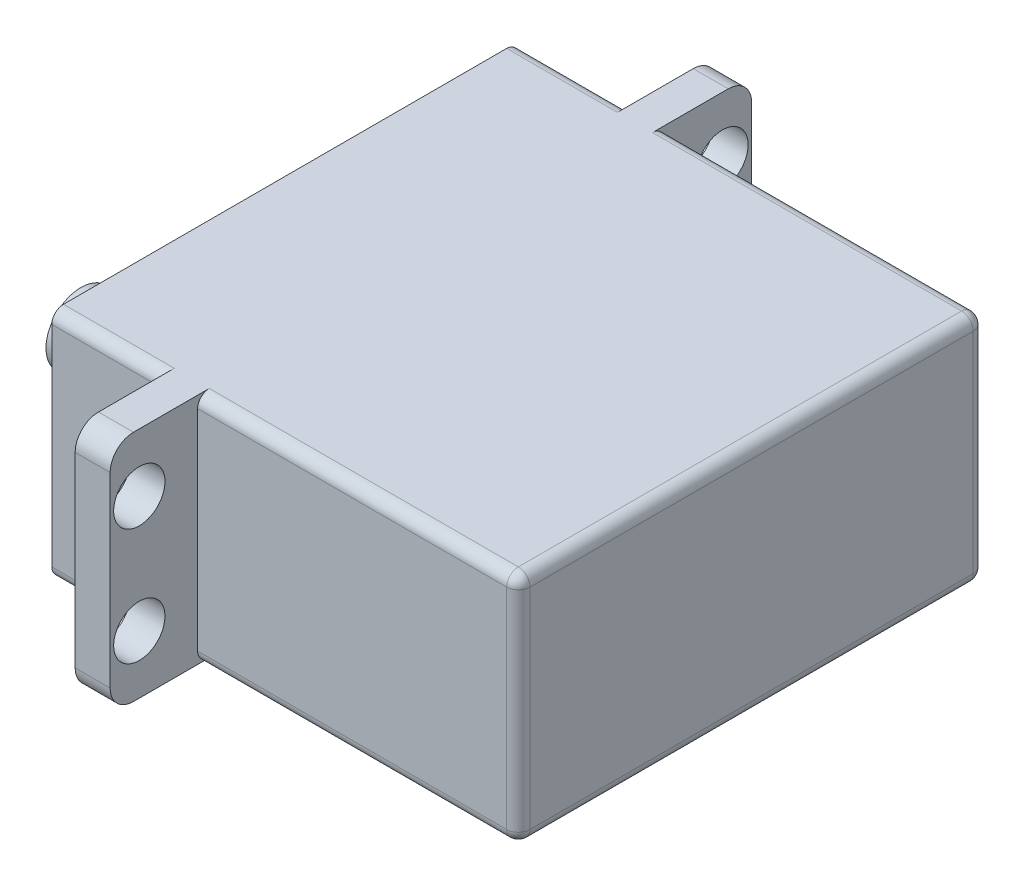
ISO-10303-21;
HEADER;
FILE_DESCRIPTION(('STEP AP214'),'2;1');
FILE_NAME('part.step','',(''),(''),'','','');
FILE_SCHEMA(('AUTOMOTIVE_DESIGN { 1 0 10303 214 1 1 1 1 }'));
ENDSEC;
DATA;
#1=APPLICATION_CONTEXT('core data for automotive mechanical design processes');
#2=APPLICATION_PROTOCOL_DEFINITION('international standard','automotive_design',2000,#1);
#3=PRODUCT_CONTEXT('',#1,'mechanical');
#4=PRODUCT('Part','Part','',(#3));
#5=PRODUCT_RELATED_PRODUCT_CATEGORY('part','',(#4));
#6=PRODUCT_DEFINITION_FORMATION('','',#4);
#7=PRODUCT_DEFINITION_CONTEXT('part definition',#1,'design');
#8=PRODUCT_DEFINITION('design','',#6,#7);
#9=PRODUCT_DEFINITION_SHAPE('','',#8);
#10=(LENGTH_UNIT() NAMED_UNIT(*) SI_UNIT(.MILLI.,.METRE.));
#11=(NAMED_UNIT(*) PLANE_ANGLE_UNIT() SI_UNIT($,.RADIAN.));
#12=(NAMED_UNIT(*) SI_UNIT($,.STERADIAN.) SOLID_ANGLE_UNIT());
#13=UNCERTAINTY_MEASURE_WITH_UNIT(LENGTH_MEASURE(1.E-05),#10,'distance_accuracy_value','');
#14=(GEOMETRIC_REPRESENTATION_CONTEXT(3) GLOBAL_UNCERTAINTY_ASSIGNED_CONTEXT((#13)) GLOBAL_UNIT_ASSIGNED_CONTEXT((#10,
#11,#12)) REPRESENTATION_CONTEXT('',''));
#15=CARTESIAN_POINT('',(0.,0.,0.));
#16=DIRECTION('',(0.,0.,1.));
#17=DIRECTION('',(1.,0.,0.));
#18=AXIS2_PLACEMENT_3D('',#15,#16,#17);
#19=CARTESIAN_POINT('',(-3.,-18.,5.5));
#20=DIRECTION('',(-1.,0.,0.));
#21=DIRECTION('',(0.,0.,1.));
#22=AXIS2_PLACEMENT_3D('',#19,#20,#21);
#23=PLANE('',#22);
#24=DIRECTION('',(0.,1.,0.));
#25=VECTOR('',#24,1.);
#26=CARTESIAN_POINT('',(-3.,-18.,0.));
#27=LINE('',#26,#25);
#28=CARTESIAN_POINT('',(-3.,-19.,0.));
#29=VERTEX_POINT('',#28);
#30=CARTESIAN_POINT('',(-3.,-1.,0.));
#31=VERTEX_POINT('',#30);
#32=EDGE_CURVE('E381',#29,#31,#27,.T.);
#33=ORIENTED_EDGE('',*,*,#32,.F.);
#34=CARTESIAN_POINT('',(-3.,-19.,-1.));
#35=DIRECTION('',(-1.,0.,0.));
#36=DIRECTION('',(0.,0.,1.));
#37=AXIS2_PLACEMENT_3D('',#34,#35,#36);
#38=CIRCLE('',#37,1.);
#39=CARTESIAN_POINT('',(-3.,-20.,-1.));
#40=VERTEX_POINT('',#39);
#41=EDGE_CURVE('E326',#29,#40,#38,.F.);
#42=ORIENTED_EDGE('',*,*,#41,.T.);
#43=DIRECTION('',(0.,0.,1.));
#44=VECTOR('',#43,1.);
#45=CARTESIAN_POINT('',(-3.,-20.,5.49999999999999));
#46=LINE('',#45,#44);
#47=CARTESIAN_POINT('',(-3.,-20.,5.49999999999999));
#48=VERTEX_POINT('',#47);
#49=EDGE_CURVE('E227',#40,#48,#46,.T.);
#50=ORIENTED_EDGE('',*,*,#49,.T.);
#51=CARTESIAN_POINT('',(-3.,-18.,5.5));
#52=DIRECTION('',(-1.,0.,0.));
#53=DIRECTION('',(0.,0.,1.));
#54=AXIS2_PLACEMENT_3D('',#51,#52,#53);
#55=CIRCLE('',#54,2.);
#56=CARTESIAN_POINT('',(-3.,-18.,7.5));
#57=VERTEX_POINT('',#56);
#58=EDGE_CURVE('E221',#48,#57,#55,.T.);
#59=ORIENTED_EDGE('',*,*,#58,.T.);
#60=DIRECTION('',(0.,1.,0.));
#61=VECTOR('',#60,1.);
#62=CARTESIAN_POINT('',(-3.,-2.00000000000001,7.5));
#63=LINE('',#62,#61);
#64=CARTESIAN_POINT('',(-3.,-2.00000000000001,7.5));
#65=VERTEX_POINT('',#64);
#66=EDGE_CURVE('E210',#57,#65,#63,.T.);
#67=ORIENTED_EDGE('',*,*,#66,.T.);
#68=CARTESIAN_POINT('',(-3.,-2.,5.5));
#69=DIRECTION('',(-1.,0.,0.));
#70=DIRECTION('',(0.,0.,-1.));
#71=AXIS2_PLACEMENT_3D('',#68,#69,#70);
#72=CIRCLE('',#71,2.);
#73=CARTESIAN_POINT('',(-3.,0.,5.49999999999999));
#74=VERTEX_POINT('',#73);
#75=EDGE_CURVE('E220',#65,#74,#72,.T.);
#76=ORIENTED_EDGE('',*,*,#75,.T.);
#77=DIRECTION('',(0.,0.,-1.));
#78=VECTOR('',#77,1.);
#79=CARTESIAN_POINT('',(-3.,0.,5.49999999999999));
#80=LINE('',#79,#78);
#81=CARTESIAN_POINT('',(-3.,0.,-1.));
#82=VERTEX_POINT('',#81);
#83=EDGE_CURVE('E410',#74,#82,#80,.T.);
#84=ORIENTED_EDGE('',*,*,#83,.T.);
#85=CARTESIAN_POINT('',(-3.,-1.,-1.));
#86=DIRECTION('',(-1.,0.,0.));
#87=DIRECTION('',(0.,0.,1.));
#88=AXIS2_PLACEMENT_3D('',#85,#86,#87);
#89=CIRCLE('',#88,1.);
#90=EDGE_CURVE('E324',#82,#31,#89,.F.);
#91=ORIENTED_EDGE('',*,*,#90,.T.);
#92=EDGE_LOOP('',(#33,#42,#50,#59,#67,#76,#84,#91));
#93=FACE_BOUND('',#92,.T.);
#94=CARTESIAN_POINT('',(-3.,-5.,5.));
#95=DIRECTION('',(-1.,0.,0.));
#96=DIRECTION('',(0.,0.,-1.));
#97=AXIS2_PLACEMENT_3D('',#94,#95,#96);
#98=CIRCLE('',#97,2.2);
#99=CARTESIAN_POINT('',(-3.,-5.,2.8));
#100=VERTEX_POINT('',#99);
#101=EDGE_CURVE('E403',#100,#100,#98,.T.);
#102=ORIENTED_EDGE('',*,*,#101,.F.);
#103=EDGE_LOOP('',(#102));
#104=FACE_BOUND('',#103,.T.);
#105=CARTESIAN_POINT('',(-3.,-15.,5.));
#106=DIRECTION('',(-1.,0.,0.));
#107=DIRECTION('',(0.,0.,1.));
#108=AXIS2_PLACEMENT_3D('',#105,#106,#107);
#109=CIRCLE('',#108,2.2);
#110=CARTESIAN_POINT('',(-3.,-15.,7.2));
#111=VERTEX_POINT('',#110);
#112=EDGE_CURVE('E391',#111,#111,#109,.T.);
#113=ORIENTED_EDGE('',*,*,#112,.F.);
#114=EDGE_LOOP('',(#113));
#115=FACE_BOUND('',#114,.T.);
#116=ADVANCED_FACE('F36',(#93,#104,#115),#23,.T.);
#117=CARTESIAN_POINT('',(27.5,0.,-40.));
#118=DIRECTION('',(0.,0.,-1.));
#119=DIRECTION('',(0.,1.,0.));
#120=AXIS2_PLACEMENT_3D('',#117,#118,#119);
#121=PLANE('',#120);
#122=DIRECTION('',(0.,-1.,0.));
#123=VECTOR('',#122,1.);
#124=CARTESIAN_POINT('',(26.5,0.,-40.));
#125=LINE('',#124,#123);
#126=CARTESIAN_POINT('',(26.5,-1.,-40.));
#127=VERTEX_POINT('',#126);
#128=CARTESIAN_POINT('',(26.5,-19.,-40.));
#129=VERTEX_POINT('',#128);
#130=EDGE_CURVE('E276',#127,#129,#125,.T.);
#131=ORIENTED_EDGE('',*,*,#130,.T.);
#132=DIRECTION('',(-1.,0.,0.));
#133=VECTOR('',#132,1.);
#134=CARTESIAN_POINT('',(0.,-19.,-40.));
#135=LINE('',#134,#133);
#136=CARTESIAN_POINT('',(0.,-19.,-40.));
#137=VERTEX_POINT('',#136);
#138=EDGE_CURVE('E278',#129,#137,#135,.T.);
#139=ORIENTED_EDGE('',*,*,#138,.T.);
#140=DIRECTION('',(0.,-1.,0.));
#141=VECTOR('',#140,1.);
#142=CARTESIAN_POINT('',(0.,0.,-40.));
#143=LINE('',#142,#141);
#144=CARTESIAN_POINT('',(0.,-1.,-40.));
#145=VERTEX_POINT('',#144);
#146=EDGE_CURVE('E236',#145,#137,#143,.T.);
#147=ORIENTED_EDGE('',*,*,#146,.F.);
#148=DIRECTION('',(-1.,0.,0.));
#149=VECTOR('',#148,1.);
#150=CARTESIAN_POINT('',(27.5,-1.,-40.));
#151=LINE('',#150,#149);
#152=EDGE_CURVE('E274',#145,#127,#151,.F.);
#153=ORIENTED_EDGE('',*,*,#152,.T.);
#154=EDGE_LOOP('',(#131,#139,#147,#153));
#155=FACE_BOUND('',#154,.T.);
#156=ADVANCED_FACE('F544',(#155),#121,.T.);
#157=CARTESIAN_POINT('',(27.5,0.,0.));
#158=DIRECTION('',(0.,1.,0.));
#159=DIRECTION('',(0.,0.,1.));
#160=AXIS2_PLACEMENT_3D('',#157,#158,#159);
#161=PLANE('',#160);
#162=CARTESIAN_POINT('',(-3.,0.,-39.));
#163=VERTEX_POINT('',#162);
#164=CARTESIAN_POINT('',(-3.,0.,-45.5));
#165=VERTEX_POINT('',#164);
#166=EDGE_CURVE('E409',#163,#165,#80,.T.);
#167=ORIENTED_EDGE('',*,*,#166,.F.);
#168=DIRECTION('',(1.,0.,0.));
#169=VECTOR('',#168,1.);
#170=CARTESIAN_POINT('',(27.5,0.,-39.));
#171=LINE('',#170,#169);
#172=CARTESIAN_POINT('',(-12.5,0.,-39.));
#173=VERTEX_POINT('',#172);
#174=EDGE_CURVE('E290',#163,#173,#171,.F.);
#175=ORIENTED_EDGE('',*,*,#174,.T.);
#176=DIRECTION('',(0.,0.,1.));
#177=VECTOR('',#176,1.);
#178=CARTESIAN_POINT('',(-12.5,0.,0.));
#179=LINE('',#178,#177);
#180=CARTESIAN_POINT('',(-12.5,0.,-1.));
#181=VERTEX_POINT('',#180);
#182=EDGE_CURVE('E378',#173,#181,#179,.T.);
#183=ORIENTED_EDGE('',*,*,#182,.T.);
#184=DIRECTION('',(1.,0.,0.));
#185=VECTOR('',#184,1.);
#186=CARTESIAN_POINT('',(27.5,0.,-1.));
#187=LINE('',#186,#185);
#188=EDGE_CURVE('E287',#181,#82,#187,.T.);
#189=ORIENTED_EDGE('',*,*,#188,.T.);
#190=ORIENTED_EDGE('',*,*,#83,.F.);
#191=DIRECTION('',(1.,0.,0.));
#192=VECTOR('',#191,1.);
#193=CARTESIAN_POINT('',(-3.,0.,5.49999999999999));
#194=LINE('',#193,#192);
#195=CARTESIAN_POINT('',(0.,0.,5.49999999999999));
#196=VERTEX_POINT('',#195);
#197=EDGE_CURVE('E241',#74,#196,#194,.T.);
#198=ORIENTED_EDGE('',*,*,#197,.T.);
#199=DIRECTION('',(0.,0.,-1.));
#200=VECTOR('',#199,1.);
#201=CARTESIAN_POINT('',(0.,0.,5.49999999999999));
#202=LINE('',#201,#200);
#203=CARTESIAN_POINT('',(0.,0.,-1.));
#204=VERTEX_POINT('',#203);
#205=EDGE_CURVE('E427',#196,#204,#202,.T.);
#206=ORIENTED_EDGE('',*,*,#205,.T.);
#207=DIRECTION('',(-1.,0.,0.));
#208=VECTOR('',#207,1.);
#209=CARTESIAN_POINT('',(27.5,0.,-1.));
#210=LINE('',#209,#208);
#211=CARTESIAN_POINT('',(26.5,0.,-1.));
#212=VERTEX_POINT('',#211);
#213=EDGE_CURVE('E280',#204,#212,#210,.F.);
#214=ORIENTED_EDGE('',*,*,#213,.T.);
#215=DIRECTION('',(0.,0.,-1.));
#216=VECTOR('',#215,1.);
#217=CARTESIAN_POINT('',(26.5,0.,0.));
#218=LINE('',#217,#216);
#219=CARTESIAN_POINT('',(26.5,0.,-39.));
#220=VERTEX_POINT('',#219);
#221=EDGE_CURVE('E282',#212,#220,#218,.T.);
#222=ORIENTED_EDGE('',*,*,#221,.T.);
#223=DIRECTION('',(-1.,0.,0.));
#224=VECTOR('',#223,1.);
#225=CARTESIAN_POINT('',(27.5,0.,-39.));
#226=LINE('',#225,#224);
#227=CARTESIAN_POINT('',(0.,0.,-39.));
#228=VERTEX_POINT('',#227);
#229=EDGE_CURVE('E284',#220,#228,#226,.T.);
#230=ORIENTED_EDGE('',*,*,#229,.T.);
#231=CARTESIAN_POINT('',(0.,0.,-45.5));
#232=VERTEX_POINT('',#231);
#233=EDGE_CURVE('E426',#228,#232,#202,.T.);
#234=ORIENTED_EDGE('',*,*,#233,.T.);
#235=DIRECTION('',(1.,0.,0.));
#236=VECTOR('',#235,1.);
#237=CARTESIAN_POINT('',(-3.,0.,-45.5));
#238=LINE('',#237,#236);
#239=EDGE_CURVE('E447',#165,#232,#238,.T.);
#240=ORIENTED_EDGE('',*,*,#239,.F.);
#241=EDGE_LOOP('',(#167,#175,#183,#189,#190,#198,#206,#214,#222,#230,#234,#240));
#242=FACE_BOUND('',#241,.T.);
#243=ADVANCED_FACE('F454',(#242),#161,.T.);
#244=CARTESIAN_POINT('',(27.5,0.,0.));
#245=DIRECTION('',(0.,0.,-1.));
#246=DIRECTION('',(0.,1.,0.));
#247=AXIS2_PLACEMENT_3D('',#244,#245,#246);
#248=PLANE('',#247);
#249=DIRECTION('',(0.,-1.,0.));
#250=VECTOR('',#249,1.);
#251=CARTESIAN_POINT('',(0.,0.,0.));
#252=LINE('',#251,#250);
#253=CARTESIAN_POINT('',(0.,-1.,0.));
#254=VERTEX_POINT('',#253);
#255=CARTESIAN_POINT('',(0.,-19.,0.));
#256=VERTEX_POINT('',#255);
#257=EDGE_CURVE('E239',#254,#256,#252,.T.);
#258=ORIENTED_EDGE('',*,*,#257,.T.);
#259=DIRECTION('',(-1.,0.,0.));
#260=VECTOR('',#259,1.);
#261=CARTESIAN_POINT('',(27.5,-19.,0.));
#262=LINE('',#261,#260);
#263=CARTESIAN_POINT('',(26.5,-19.,0.));
#264=VERTEX_POINT('',#263);
#265=EDGE_CURVE('E53',#256,#264,#262,.F.);
#266=ORIENTED_EDGE('',*,*,#265,.T.);
#267=DIRECTION('',(0.,-1.,0.));
#268=VECTOR('',#267,1.);
#269=CARTESIAN_POINT('',(26.5,0.,0.));
#270=LINE('',#269,#268);
#271=CARTESIAN_POINT('',(26.5,-1.,0.));
#272=VERTEX_POINT('',#271);
#273=EDGE_CURVE('E57',#264,#272,#270,.F.);
#274=ORIENTED_EDGE('',*,*,#273,.T.);
#275=DIRECTION('',(-1.,0.,0.));
#276=VECTOR('',#275,1.);
#277=CARTESIAN_POINT('',(0.,-1.,0.));
#278=LINE('',#277,#276);
#279=EDGE_CURVE('E310',#272,#254,#278,.T.);
#280=ORIENTED_EDGE('',*,*,#279,.T.);
#281=EDGE_LOOP('',(#258,#266,#274,#280));
#282=FACE_BOUND('',#281,.T.);
#283=ADVANCED_FACE('F583',(#282),#248,.F.);
#284=CARTESIAN_POINT('',(27.5,-20.,0.));
#285=DIRECTION('',(0.,1.,0.));
#286=DIRECTION('',(0.,0.,1.));
#287=AXIS2_PLACEMENT_3D('',#284,#285,#286);
#288=PLANE('',#287);
#289=DIRECTION('',(0.,0.,-1.));
#290=VECTOR('',#289,1.);
#291=CARTESIAN_POINT('',(-12.5,-20.,0.));
#292=LINE('',#291,#290);
#293=CARTESIAN_POINT('',(-12.5,-20.,-1.));
#294=VERTEX_POINT('',#293);
#295=CARTESIAN_POINT('',(-12.5,-20.,-39.));
#296=VERTEX_POINT('',#295);
#297=EDGE_CURVE('E370',#294,#296,#292,.T.);
#298=ORIENTED_EDGE('',*,*,#297,.T.);
#299=DIRECTION('',(1.,0.,0.));
#300=VECTOR('',#299,1.);
#301=CARTESIAN_POINT('',(-3.,-20.,-39.));
#302=LINE('',#301,#300);
#303=CARTESIAN_POINT('',(-3.,-20.,-39.));
#304=VERTEX_POINT('',#303);
#305=EDGE_CURVE('E271',#296,#304,#302,.T.);
#306=ORIENTED_EDGE('',*,*,#305,.T.);
#307=CARTESIAN_POINT('',(-3.,-20.,-45.5));
#308=VERTEX_POINT('',#307);
#309=EDGE_CURVE('E418',#308,#304,#46,.T.);
#310=ORIENTED_EDGE('',*,*,#309,.F.);
#311=DIRECTION('',(1.,0.,0.));
#312=VECTOR('',#311,1.);
#313=CARTESIAN_POINT('',(-3.,-20.,-45.5));
#314=LINE('',#313,#312);
#315=CARTESIAN_POINT('',(0.,-20.,-45.5));
#316=VERTEX_POINT('',#315);
#317=EDGE_CURVE('E438',#308,#316,#314,.T.);
#318=ORIENTED_EDGE('',*,*,#317,.T.);
#319=DIRECTION('',(0.,0.,1.));
#320=VECTOR('',#319,1.);
#321=CARTESIAN_POINT('',(0.,-20.,5.49999999999999));
#322=LINE('',#321,#320);
#323=CARTESIAN_POINT('',(0.,-20.,-39.));
#324=VERTEX_POINT('',#323);
#325=EDGE_CURVE('E231',#316,#324,#322,.T.);
#326=ORIENTED_EDGE('',*,*,#325,.T.);
#327=DIRECTION('',(-1.,0.,0.));
#328=VECTOR('',#327,1.);
#329=CARTESIAN_POINT('',(27.5,-20.,-39.));
#330=LINE('',#329,#328);
#331=CARTESIAN_POINT('',(26.5,-20.,-39.));
#332=VERTEX_POINT('',#331);
#333=EDGE_CURVE('E267',#324,#332,#330,.F.);
#334=ORIENTED_EDGE('',*,*,#333,.T.);
#335=DIRECTION('',(0.,0.,-1.));
#336=VECTOR('',#335,1.);
#337=CARTESIAN_POINT('',(26.5,-20.,0.));
#338=LINE('',#337,#336);
#339=CARTESIAN_POINT('',(26.5,-20.,-1.00000000000001));
#340=VERTEX_POINT('',#339);
#341=EDGE_CURVE('E264',#332,#340,#338,.F.);
#342=ORIENTED_EDGE('',*,*,#341,.T.);
#343=DIRECTION('',(-1.,0.,0.));
#344=VECTOR('',#343,1.);
#345=CARTESIAN_POINT('',(27.5,-20.,-1.00000000000001));
#346=LINE('',#345,#344);
#347=CARTESIAN_POINT('',(0.,-20.,-1.00000000000001));
#348=VERTEX_POINT('',#347);
#349=EDGE_CURVE('E261',#340,#348,#346,.T.);
#350=ORIENTED_EDGE('',*,*,#349,.T.);
#351=CARTESIAN_POINT('',(0.,-20.,5.49999999999999));
#352=VERTEX_POINT('',#351);
#353=EDGE_CURVE('E435',#348,#352,#322,.T.);
#354=ORIENTED_EDGE('',*,*,#353,.T.);
#355=DIRECTION('',(1.,0.,0.));
#356=VECTOR('',#355,1.);
#357=CARTESIAN_POINT('',(-3.,-20.,5.49999999999999));
#358=LINE('',#357,#356);
#359=EDGE_CURVE('E420',#48,#352,#358,.T.);
#360=ORIENTED_EDGE('',*,*,#359,.F.);
#361=ORIENTED_EDGE('',*,*,#49,.F.);
#362=DIRECTION('',(1.,0.,0.));
#363=VECTOR('',#362,1.);
#364=CARTESIAN_POINT('',(-12.5,-20.,-1.));
#365=LINE('',#364,#363);
#366=EDGE_CURVE('E269',#40,#294,#365,.F.);
#367=ORIENTED_EDGE('',*,*,#366,.T.);
#368=EDGE_LOOP('',(#298,#306,#310,#318,#326,#334,#342,#350,#354,#360,#361,#367));
#369=FACE_BOUND('',#368,.T.);
#370=ADVANCED_FACE('F525',(#369),#288,.F.);
#371=CARTESIAN_POINT('',(27.5,0.,0.));
#372=DIRECTION('',(1.,0.,0.));
#373=DIRECTION('',(0.,0.,-1.));
#374=AXIS2_PLACEMENT_3D('',#371,#372,#373);
#375=PLANE('',#374);
#376=DIRECTION('',(0.,-1.,0.));
#377=VECTOR('',#376,1.);
#378=CARTESIAN_POINT('',(27.5,-20.,-1.00000000000001));
#379=LINE('',#378,#377);
#380=CARTESIAN_POINT('',(27.5,-1.,-1.));
#381=VERTEX_POINT('',#380);
#382=CARTESIAN_POINT('',(27.5,-19.,-1.00000000000001));
#383=VERTEX_POINT('',#382);
#384=EDGE_CURVE('E252',#381,#383,#379,.T.);
#385=ORIENTED_EDGE('',*,*,#384,.T.);
#386=DIRECTION('',(0.,0.,-1.));
#387=VECTOR('',#386,1.);
#388=CARTESIAN_POINT('',(27.5,-19.,-40.));
#389=LINE('',#388,#387);
#390=CARTESIAN_POINT('',(27.5,-19.,-39.));
#391=VERTEX_POINT('',#390);
#392=EDGE_CURVE('E258',#383,#391,#389,.T.);
#393=ORIENTED_EDGE('',*,*,#392,.T.);
#394=DIRECTION('',(0.,-1.,0.));
#395=VECTOR('',#394,1.);
#396=CARTESIAN_POINT('',(27.5,0.,-39.));
#397=LINE('',#396,#395);
#398=CARTESIAN_POINT('',(27.5,-1.,-39.));
#399=VERTEX_POINT('',#398);
#400=EDGE_CURVE('E256',#391,#399,#397,.F.);
#401=ORIENTED_EDGE('',*,*,#400,.T.);
#402=DIRECTION('',(0.,0.,-1.));
#403=VECTOR('',#402,1.);
#404=CARTESIAN_POINT('',(27.5,-1.,0.));
#405=LINE('',#404,#403);
#406=EDGE_CURVE('E254',#399,#381,#405,.F.);
#407=ORIENTED_EDGE('',*,*,#406,.T.);
#408=EDGE_LOOP('',(#385,#393,#401,#407));
#409=FACE_BOUND('',#408,.T.);
#410=ADVANCED_FACE('F558',(#409),#375,.T.);
#411=CARTESIAN_POINT('',(0.,-18.,5.5));
#412=DIRECTION('',(-1.,0.,0.));
#413=DIRECTION('',(0.,0.,1.));
#414=AXIS2_PLACEMENT_3D('',#411,#412,#413);
#415=PLANE('',#414);
#416=CARTESIAN_POINT('',(0.,-15.,-45.));
#417=DIRECTION('',(-1.,0.,0.));
#418=DIRECTION('',(0.,0.,-1.));
#419=AXIS2_PLACEMENT_3D('',#416,#417,#418);
#420=CIRCLE('',#419,2.2);
#421=CARTESIAN_POINT('',(0.,-15.,-47.2));
#422=VERTEX_POINT('',#421);
#423=EDGE_CURVE('E384',#422,#422,#420,.T.);
#424=ORIENTED_EDGE('',*,*,#423,.T.);
#425=EDGE_LOOP('',(#424));
#426=FACE_BOUND('',#425,.T.);
#427=CARTESIAN_POINT('',(0.,-5.,-45.));
#428=DIRECTION('',(-1.,0.,0.));
#429=DIRECTION('',(0.,0.,1.));
#430=AXIS2_PLACEMENT_3D('',#427,#428,#429);
#431=CIRCLE('',#430,2.2);
#432=CARTESIAN_POINT('',(0.,-5.,-42.8));
#433=VERTEX_POINT('',#432);
#434=EDGE_CURVE('E394',#433,#433,#431,.T.);
#435=ORIENTED_EDGE('',*,*,#434,.T.);
#436=EDGE_LOOP('',(#435));
#437=FACE_BOUND('',#436,.T.);
#438=ORIENTED_EDGE('',*,*,#233,.F.);
#439=CARTESIAN_POINT('',(0.,-1.,-39.));
#440=DIRECTION('',(-1.,0.,0.));
#441=DIRECTION('',(0.,0.,1.));
#442=AXIS2_PLACEMENT_3D('',#439,#440,#441);
#443=CIRCLE('',#442,1.);
#444=EDGE_CURVE('E322',#228,#145,#443,.T.);
#445=ORIENTED_EDGE('',*,*,#444,.T.);
#446=ORIENTED_EDGE('',*,*,#146,.T.);
#447=CARTESIAN_POINT('',(0.,-19.,-39.));
#448=DIRECTION('',(-1.,0.,0.));
#449=DIRECTION('',(0.,0.,1.));
#450=AXIS2_PLACEMENT_3D('',#447,#448,#449);
#451=CIRCLE('',#450,1.);
#452=EDGE_CURVE('E319',#137,#324,#451,.T.);
#453=ORIENTED_EDGE('',*,*,#452,.T.);
#454=ORIENTED_EDGE('',*,*,#325,.F.);
#455=CARTESIAN_POINT('',(0.,-18.,-45.5));
#456=DIRECTION('',(-1.,0.,0.));
#457=DIRECTION('',(0.,0.,1.));
#458=AXIS2_PLACEMENT_3D('',#455,#456,#457);
#459=CIRCLE('',#458,2.);
#460=CARTESIAN_POINT('',(0.,-18.,-47.5));
#461=VERTEX_POINT('',#460);
#462=EDGE_CURVE('E433',#461,#316,#459,.T.);
#463=ORIENTED_EDGE('',*,*,#462,.F.);
#464=DIRECTION('',(0.,-1.,0.));
#465=VECTOR('',#464,1.);
#466=CARTESIAN_POINT('',(0.,-2.00000000000001,-47.5));
#467=LINE('',#466,#465);
#468=CARTESIAN_POINT('',(0.,-2.00000000000001,-47.5));
#469=VERTEX_POINT('',#468);
#470=EDGE_CURVE('E431',#469,#461,#467,.T.);
#471=ORIENTED_EDGE('',*,*,#470,.F.);
#472=CARTESIAN_POINT('',(0.,-2.,-45.5));
#473=DIRECTION('',(-1.,0.,0.));
#474=DIRECTION('',(0.,0.,-1.));
#475=AXIS2_PLACEMENT_3D('',#472,#473,#474);
#476=CIRCLE('',#475,2.);
#477=EDGE_CURVE('E429',#232,#469,#476,.T.);
#478=ORIENTED_EDGE('',*,*,#477,.F.);
#479=EDGE_LOOP('',(#438,#445,#446,#453,#454,#463,#471,#478));
#480=FACE_BOUND('',#479,.T.);
#481=ADVANCED_FACE('F488',(#426,#437,#480),#415,.F.);
#482=DIRECTION('',(0.,-1.,0.));
#483=VECTOR('',#482,1.);
#484=CARTESIAN_POINT('',(-3.,-18.,-40.));
#485=LINE('',#484,#483);
#486=CARTESIAN_POINT('',(-3.,-1.,-40.));
#487=VERTEX_POINT('',#486);
#488=CARTESIAN_POINT('',(-3.,-19.,-40.));
#489=VERTEX_POINT('',#488);
#490=EDGE_CURVE('E246',#487,#489,#485,.T.);
#491=ORIENTED_EDGE('',*,*,#490,.F.);
#492=CARTESIAN_POINT('',(-3.,-1.,-39.));
#493=DIRECTION('',(-1.,0.,0.));
#494=DIRECTION('',(0.,0.,1.));
#495=AXIS2_PLACEMENT_3D('',#492,#493,#494);
#496=CIRCLE('',#495,1.);
#497=EDGE_CURVE('E314',#487,#163,#496,.F.);
#498=ORIENTED_EDGE('',*,*,#497,.T.);
#499=ORIENTED_EDGE('',*,*,#166,.T.);
#500=CARTESIAN_POINT('',(-3.,-2.,-45.5));
#501=DIRECTION('',(-1.,0.,0.));
#502=DIRECTION('',(0.,0.,-1.));
#503=AXIS2_PLACEMENT_3D('',#500,#501,#502);
#504=CIRCLE('',#503,2.);
#505=CARTESIAN_POINT('',(-3.,-2.00000000000001,-47.5));
#506=VERTEX_POINT('',#505);
#507=EDGE_CURVE('E412',#165,#506,#504,.T.);
#508=ORIENTED_EDGE('',*,*,#507,.T.);
#509=DIRECTION('',(0.,-1.,0.));
#510=VECTOR('',#509,1.);
#511=CARTESIAN_POINT('',(-3.,-2.00000000000001,-47.5));
#512=LINE('',#511,#510);
#513=CARTESIAN_POINT('',(-3.,-18.,-47.5));
#514=VERTEX_POINT('',#513);
#515=EDGE_CURVE('E414',#506,#514,#512,.T.);
#516=ORIENTED_EDGE('',*,*,#515,.T.);
#517=CARTESIAN_POINT('',(-3.,-18.,-45.5));
#518=DIRECTION('',(-1.,0.,0.));
#519=DIRECTION('',(0.,0.,1.));
#520=AXIS2_PLACEMENT_3D('',#517,#518,#519);
#521=CIRCLE('',#520,2.);
#522=EDGE_CURVE('E416',#514,#308,#521,.T.);
#523=ORIENTED_EDGE('',*,*,#522,.T.);
#524=ORIENTED_EDGE('',*,*,#309,.T.);
#525=CARTESIAN_POINT('',(-3.,-19.,-39.));
#526=DIRECTION('',(-1.,0.,0.));
#527=DIRECTION('',(0.,0.,1.));
#528=AXIS2_PLACEMENT_3D('',#525,#526,#527);
#529=CIRCLE('',#528,1.);
#530=EDGE_CURVE('E317',#304,#489,#529,.F.);
#531=ORIENTED_EDGE('',*,*,#530,.T.);
#532=EDGE_LOOP('',(#491,#498,#499,#508,#516,#523,#524,#531));
#533=FACE_BOUND('',#532,.T.);
#534=CARTESIAN_POINT('',(-3.,-5.,-45.));
#535=DIRECTION('',(-1.,0.,0.));
#536=DIRECTION('',(0.,0.,1.));
#537=AXIS2_PLACEMENT_3D('',#534,#535,#536);
#538=CIRCLE('',#537,2.2);
#539=CARTESIAN_POINT('',(-3.,-5.,-42.8));
#540=VERTEX_POINT('',#539);
#541=EDGE_CURVE('E397',#540,#540,#538,.T.);
#542=ORIENTED_EDGE('',*,*,#541,.F.);
#543=EDGE_LOOP('',(#542));
#544=FACE_BOUND('',#543,.T.);
#545=CARTESIAN_POINT('',(-3.,-15.,-45.));
#546=DIRECTION('',(-1.,0.,0.));
#547=DIRECTION('',(0.,0.,-1.));
#548=AXIS2_PLACEMENT_3D('',#545,#546,#547);
#549=CIRCLE('',#548,2.2);
#550=CARTESIAN_POINT('',(-3.,-15.,-47.2));
#551=VERTEX_POINT('',#550);
#552=EDGE_CURVE('E385',#551,#551,#549,.T.);
#553=ORIENTED_EDGE('',*,*,#552,.F.);
#554=EDGE_LOOP('',(#553));
#555=FACE_BOUND('',#554,.T.);
#556=ADVANCED_FACE('F502',(#533,#544,#555),#23,.T.);
#557=ORIENTED_EDGE('',*,*,#257,.F.);
#558=CARTESIAN_POINT('',(0.,-1.,-1.));
#559=DIRECTION('',(-1.,0.,0.));
#560=DIRECTION('',(0.,0.,1.));
#561=AXIS2_PLACEMENT_3D('',#558,#559,#560);
#562=CIRCLE('',#561,1.);
#563=EDGE_CURVE('E11',#254,#204,#562,.T.);
#564=ORIENTED_EDGE('',*,*,#563,.T.);
#565=ORIENTED_EDGE('',*,*,#205,.F.);
#566=CARTESIAN_POINT('',(0.,-2.,5.5));
#567=DIRECTION('',(-1.,0.,0.));
#568=DIRECTION('',(0.,0.,-1.));
#569=AXIS2_PLACEMENT_3D('',#566,#567,#568);
#570=CIRCLE('',#569,2.);
#571=CARTESIAN_POINT('',(0.,-2.00000000000001,7.5));
#572=VERTEX_POINT('',#571);
#573=EDGE_CURVE('E424',#572,#196,#570,.T.);
#574=ORIENTED_EDGE('',*,*,#573,.F.);
#575=DIRECTION('',(0.,1.,0.));
#576=VECTOR('',#575,1.);
#577=CARTESIAN_POINT('',(0.,-2.00000000000001,7.5));
#578=LINE('',#577,#576);
#579=CARTESIAN_POINT('',(0.,-18.,7.5));
#580=VERTEX_POINT('',#579);
#581=EDGE_CURVE('E422',#580,#572,#578,.T.);
#582=ORIENTED_EDGE('',*,*,#581,.F.);
#583=CARTESIAN_POINT('',(0.,-18.,5.5));
#584=DIRECTION('',(-1.,0.,0.));
#585=DIRECTION('',(0.,0.,1.));
#586=AXIS2_PLACEMENT_3D('',#583,#584,#585);
#587=CIRCLE('',#586,2.);
#588=EDGE_CURVE('E235',#352,#580,#587,.T.);
#589=ORIENTED_EDGE('',*,*,#588,.F.);
#590=ORIENTED_EDGE('',*,*,#353,.F.);
#591=CARTESIAN_POINT('',(0.,-19.,-1.00000000000001));
#592=DIRECTION('',(-1.,0.,0.));
#593=DIRECTION('',(0.,0.,1.));
#594=AXIS2_PLACEMENT_3D('',#591,#592,#593);
#595=CIRCLE('',#594,1.);
#596=EDGE_CURVE('E45',#348,#256,#595,.T.);
#597=ORIENTED_EDGE('',*,*,#596,.T.);
#598=EDGE_LOOP('',(#557,#564,#565,#574,#582,#589,#590,#597));
#599=FACE_BOUND('',#598,.T.);
#600=CARTESIAN_POINT('',(0.,-5.,5.));
#601=DIRECTION('',(-1.,0.,0.));
#602=DIRECTION('',(0.,0.,-1.));
#603=AXIS2_PLACEMENT_3D('',#600,#601,#602);
#604=CIRCLE('',#603,2.2);
#605=CARTESIAN_POINT('',(0.,-5.,2.8));
#606=VERTEX_POINT('',#605);
#607=EDGE_CURVE('E400',#606,#606,#604,.T.);
#608=ORIENTED_EDGE('',*,*,#607,.T.);
#609=EDGE_LOOP('',(#608));
#610=FACE_BOUND('',#609,.T.);
#611=CARTESIAN_POINT('',(0.,-15.,5.));
#612=DIRECTION('',(-1.,0.,0.));
#613=DIRECTION('',(0.,0.,1.));
#614=AXIS2_PLACEMENT_3D('',#611,#612,#613);
#615=CIRCLE('',#614,2.2);
#616=CARTESIAN_POINT('',(0.,-15.,7.2));
#617=VERTEX_POINT('',#616);
#618=EDGE_CURVE('E388',#617,#617,#615,.T.);
#619=ORIENTED_EDGE('',*,*,#618,.T.);
#620=EDGE_LOOP('',(#619));
#621=FACE_BOUND('',#620,.T.);
#622=ADVANCED_FACE('F459',(#599,#610,#621),#415,.F.);
#623=CARTESIAN_POINT('',(-3.,-18.,5.5));
#624=DIRECTION('',(1.,0.,0.));
#625=DIRECTION('',(0.,0.,-1.));
#626=AXIS2_PLACEMENT_3D('',#623,#624,#625);
#627=CYLINDRICAL_SURFACE('',#626,2.);
#628=ORIENTED_EDGE('',*,*,#588,.T.);
#629=DIRECTION('',(1.,0.,0.));
#630=VECTOR('',#629,1.);
#631=CARTESIAN_POINT('',(-3.,-18.,7.5));
#632=LINE('',#631,#630);
#633=EDGE_CURVE('E214',#57,#580,#632,.T.);
#634=ORIENTED_EDGE('',*,*,#633,.F.);
#635=ORIENTED_EDGE('',*,*,#58,.F.);
#636=ORIENTED_EDGE('',*,*,#359,.T.);
#637=EDGE_LOOP('',(#628,#634,#635,#636));
#638=FACE_BOUND('',#637,.T.);
#639=ADVANCED_FACE('F233',(#638),#627,.T.);
#640=CARTESIAN_POINT('',(-3.,-2.00000000000001,7.5));
#641=DIRECTION('',(0.,0.,-1.));
#642=DIRECTION('',(-1.,0.,0.));
#643=AXIS2_PLACEMENT_3D('',#640,#641,#642);
#644=PLANE('',#643);
#645=ORIENTED_EDGE('',*,*,#581,.T.);
#646=DIRECTION('',(1.,0.,0.));
#647=VECTOR('',#646,1.);
#648=CARTESIAN_POINT('',(-3.,-2.00000000000001,7.5));
#649=LINE('',#648,#647);
#650=EDGE_CURVE('E217',#65,#572,#649,.T.);
#651=ORIENTED_EDGE('',*,*,#650,.F.);
#652=ORIENTED_EDGE('',*,*,#66,.F.);
#653=ORIENTED_EDGE('',*,*,#633,.T.);
#654=EDGE_LOOP('',(#645,#651,#652,#653));
#655=FACE_BOUND('',#654,.T.);
#656=ADVANCED_FACE('F212',(#655),#644,.F.);
#657=CARTESIAN_POINT('',(-3.,-2.,5.5));
#658=DIRECTION('',(1.,0.,0.));
#659=DIRECTION('',(0.,0.,-1.));
#660=AXIS2_PLACEMENT_3D('',#657,#658,#659);
#661=CYLINDRICAL_SURFACE('',#660,2.);
#662=ORIENTED_EDGE('',*,*,#573,.T.);
#663=ORIENTED_EDGE('',*,*,#197,.F.);
#664=ORIENTED_EDGE('',*,*,#75,.F.);
#665=ORIENTED_EDGE('',*,*,#650,.T.);
#666=EDGE_LOOP('',(#662,#663,#664,#665));
#667=FACE_BOUND('',#666,.T.);
#668=ADVANCED_FACE('F574',(#667),#661,.T.);
#669=CARTESIAN_POINT('',(-3.,-2.,-45.5));
#670=DIRECTION('',(1.,0.,0.));
#671=DIRECTION('',(0.,0.,-1.));
#672=AXIS2_PLACEMENT_3D('',#669,#670,#671);
#673=CYLINDRICAL_SURFACE('',#672,2.);
#674=ORIENTED_EDGE('',*,*,#477,.T.);
#675=DIRECTION('',(1.,0.,0.));
#676=VECTOR('',#675,1.);
#677=CARTESIAN_POINT('',(-3.,-2.00000000000001,-47.5));
#678=LINE('',#677,#676);
#679=EDGE_CURVE('E444',#506,#469,#678,.T.);
#680=ORIENTED_EDGE('',*,*,#679,.F.);
#681=ORIENTED_EDGE('',*,*,#507,.F.);
#682=ORIENTED_EDGE('',*,*,#239,.T.);
#683=EDGE_LOOP('',(#674,#680,#681,#682));
#684=FACE_BOUND('',#683,.T.);
#685=ADVANCED_FACE('F485',(#684),#673,.T.);
#686=CARTESIAN_POINT('',(-3.,-2.00000000000001,-47.5));
#687=DIRECTION('',(0.,0.,1.));
#688=DIRECTION('',(1.,0.,0.));
#689=AXIS2_PLACEMENT_3D('',#686,#687,#688);
#690=PLANE('',#689);
#691=ORIENTED_EDGE('',*,*,#470,.T.);
#692=DIRECTION('',(1.,0.,0.));
#693=VECTOR('',#692,1.);
#694=CARTESIAN_POINT('',(-3.,-18.,-47.5));
#695=LINE('',#694,#693);
#696=EDGE_CURVE('E441',#514,#461,#695,.T.);
#697=ORIENTED_EDGE('',*,*,#696,.F.);
#698=ORIENTED_EDGE('',*,*,#515,.F.);
#699=ORIENTED_EDGE('',*,*,#679,.T.);
#700=EDGE_LOOP('',(#691,#697,#698,#699));
#701=FACE_BOUND('',#700,.T.);
#702=ADVANCED_FACE('F493',(#701),#690,.F.);
#703=CARTESIAN_POINT('',(-3.,-18.,-45.5));
#704=DIRECTION('',(1.,0.,0.));
#705=DIRECTION('',(0.,0.,-1.));
#706=AXIS2_PLACEMENT_3D('',#703,#704,#705);
#707=CYLINDRICAL_SURFACE('',#706,2.);
#708=ORIENTED_EDGE('',*,*,#462,.T.);
#709=ORIENTED_EDGE('',*,*,#317,.F.);
#710=ORIENTED_EDGE('',*,*,#522,.F.);
#711=ORIENTED_EDGE('',*,*,#696,.T.);
#712=EDGE_LOOP('',(#708,#709,#710,#711));
#713=FACE_BOUND('',#712,.T.);
#714=ADVANCED_FACE('F497',(#713),#707,.T.);
#715=CARTESIAN_POINT('',(-3.,-5.,5.));
#716=DIRECTION('',(1.,0.,0.));
#717=DIRECTION('',(0.,0.,-1.));
#718=AXIS2_PLACEMENT_3D('',#715,#716,#717);
#719=CYLINDRICAL_SURFACE('',#718,2.2);
#720=ORIENTED_EDGE('',*,*,#101,.T.);
#721=EDGE_LOOP('',(#720));
#722=FACE_BOUND('',#721,.T.);
#723=ORIENTED_EDGE('',*,*,#607,.F.);
#724=EDGE_LOOP('',(#723));
#725=FACE_BOUND('',#724,.T.);
#726=ADVANCED_FACE('F569',(#722,#725),#719,.F.);
#727=CARTESIAN_POINT('',(-3.,-5.,-45.));
#728=DIRECTION('',(1.,0.,0.));
#729=DIRECTION('',(0.,0.,-1.));
#730=AXIS2_PLACEMENT_3D('',#727,#728,#729);
#731=CYLINDRICAL_SURFACE('',#730,2.2);
#732=ORIENTED_EDGE('',*,*,#541,.T.);
#733=EDGE_LOOP('',(#732));
#734=FACE_BOUND('',#733,.T.);
#735=ORIENTED_EDGE('',*,*,#434,.F.);
#736=EDGE_LOOP('',(#735));
#737=FACE_BOUND('',#736,.T.);
#738=ADVANCED_FACE('F823',(#734,#737),#731,.F.);
#739=CARTESIAN_POINT('',(-3.,-15.,5.));
#740=DIRECTION('',(1.,0.,0.));
#741=DIRECTION('',(0.,0.,-1.));
#742=AXIS2_PLACEMENT_3D('',#739,#740,#741);
#743=CYLINDRICAL_SURFACE('',#742,2.2);
#744=ORIENTED_EDGE('',*,*,#112,.T.);
#745=EDGE_LOOP('',(#744));
#746=FACE_BOUND('',#745,.T.);
#747=ORIENTED_EDGE('',*,*,#618,.F.);
#748=EDGE_LOOP('',(#747));
#749=FACE_BOUND('',#748,.T.);
#750=ADVANCED_FACE('F813',(#746,#749),#743,.F.);
#751=CARTESIAN_POINT('',(-3.,-15.,-45.));
#752=DIRECTION('',(1.,0.,0.));
#753=DIRECTION('',(0.,0.,-1.));
#754=AXIS2_PLACEMENT_3D('',#751,#752,#753);
#755=CYLINDRICAL_SURFACE('',#754,2.2);
#756=ORIENTED_EDGE('',*,*,#552,.T.);
#757=EDGE_LOOP('',(#756));
#758=FACE_BOUND('',#757,.T.);
#759=ORIENTED_EDGE('',*,*,#423,.F.);
#760=EDGE_LOOP('',(#759));
#761=FACE_BOUND('',#760,.T.);
#762=ADVANCED_FACE('F775',(#758,#761),#755,.F.);
#763=CARTESIAN_POINT('',(-12.5,0.,0.));
#764=DIRECTION('',(0.,0.,1.));
#765=DIRECTION('',(1.,0.,0.));
#766=AXIS2_PLACEMENT_3D('',#763,#764,#765);
#767=PLANE('',#766);
#768=ORIENTED_EDGE('',*,*,#32,.T.);
#769=DIRECTION('',(1.,0.,0.));
#770=VECTOR('',#769,1.);
#771=CARTESIAN_POINT('',(-12.5,-1.,0.));
#772=LINE('',#771,#770);
#773=CARTESIAN_POINT('',(-12.5,-1.,0.));
#774=VERTEX_POINT('',#773);
#775=EDGE_CURVE('E308',#31,#774,#772,.F.);
#776=ORIENTED_EDGE('',*,*,#775,.T.);
#777=DIRECTION('',(0.,-1.,0.));
#778=VECTOR('',#777,1.);
#779=CARTESIAN_POINT('',(-12.5,0.,0.));
#780=LINE('',#779,#778);
#781=CARTESIAN_POINT('',(-12.5,-19.,0.));
#782=VERTEX_POINT('',#781);
#783=EDGE_CURVE('E365',#774,#782,#780,.T.);
#784=ORIENTED_EDGE('',*,*,#783,.T.);
#785=DIRECTION('',(1.,0.,0.));
#786=VECTOR('',#785,1.);
#787=CARTESIAN_POINT('',(-3.,-19.,0.));
#788=LINE('',#787,#786);
#789=EDGE_CURVE('E305',#782,#29,#788,.T.);
#790=ORIENTED_EDGE('',*,*,#789,.T.);
#791=EDGE_LOOP('',(#768,#776,#784,#790));
#792=FACE_BOUND('',#791,.T.);
#793=ADVANCED_FACE('F532',(#792),#767,.T.);
#794=CARTESIAN_POINT('',(-12.5,0.,-40.));
#795=DIRECTION('',(0.,0.,-1.));
#796=DIRECTION('',(-1.,0.,0.));
#797=AXIS2_PLACEMENT_3D('',#794,#795,#796);
#798=PLANE('',#797);
#799=DIRECTION('',(0.,1.,0.));
#800=VECTOR('',#799,1.);
#801=CARTESIAN_POINT('',(-12.5,0.,-40.));
#802=LINE('',#801,#800);
#803=CARTESIAN_POINT('',(-12.5,-19.,-40.));
#804=VERTEX_POINT('',#803);
#805=CARTESIAN_POINT('',(-12.5,-1.,-40.));
#806=VERTEX_POINT('',#805);
#807=EDGE_CURVE('E375',#804,#806,#802,.T.);
#808=ORIENTED_EDGE('',*,*,#807,.T.);
#809=DIRECTION('',(1.,0.,0.));
#810=VECTOR('',#809,1.);
#811=CARTESIAN_POINT('',(-12.5,-1.,-40.));
#812=LINE('',#811,#810);
#813=EDGE_CURVE('E294',#806,#487,#812,.T.);
#814=ORIENTED_EDGE('',*,*,#813,.T.);
#815=ORIENTED_EDGE('',*,*,#490,.T.);
#816=DIRECTION('',(1.,0.,0.));
#817=VECTOR('',#816,1.);
#818=CARTESIAN_POINT('',(-12.5,-19.,-40.));
#819=LINE('',#818,#817);
#820=EDGE_CURVE('E292',#489,#804,#819,.F.);
#821=ORIENTED_EDGE('',*,*,#820,.T.);
#822=EDGE_LOOP('',(#808,#814,#815,#821));
#823=FACE_BOUND('',#822,.T.);
#824=ADVANCED_FACE('F518',(#823),#798,.T.);
#825=CARTESIAN_POINT('',(-12.5,0.,0.));
#826=DIRECTION('',(1.,0.,0.));
#827=DIRECTION('',(0.,0.,-1.));
#828=AXIS2_PLACEMENT_3D('',#825,#826,#827);
#829=PLANE('',#828);
#830=CARTESIAN_POINT('',(-12.5,-10.,-10.));
#831=DIRECTION('',(1.,0.,0.));
#832=DIRECTION('',(0.,0.,-1.));
#833=AXIS2_PLACEMENT_3D('',#830,#831,#832);
#834=CIRCLE('',#833,3.);
#835=CARTESIAN_POINT('',(-12.5,-10.,-13.));
#836=VERTEX_POINT('',#835);
#837=EDGE_CURVE('E249',#836,#836,#834,.F.);
#838=ORIENTED_EDGE('',*,*,#837,.F.);
#839=EDGE_LOOP('',(#838));
#840=FACE_BOUND('',#839,.T.);
#841=ORIENTED_EDGE('',*,*,#182,.F.);
#842=CARTESIAN_POINT('',(-12.5,-1.,-39.));
#843=DIRECTION('',(1.,0.,0.));
#844=DIRECTION('',(0.,0.,-1.));
#845=AXIS2_PLACEMENT_3D('',#842,#843,#844);
#846=CIRCLE('',#845,1.);
#847=EDGE_CURVE('E303',#173,#806,#846,.F.);
#848=ORIENTED_EDGE('',*,*,#847,.T.);
#849=ORIENTED_EDGE('',*,*,#807,.F.);
#850=CARTESIAN_POINT('',(-12.5,-19.,-39.));
#851=DIRECTION('',(1.,0.,0.));
#852=DIRECTION('',(0.,0.,-1.));
#853=AXIS2_PLACEMENT_3D('',#850,#851,#852);
#854=CIRCLE('',#853,1.);
#855=EDGE_CURVE('E301',#804,#296,#854,.F.);
#856=ORIENTED_EDGE('',*,*,#855,.T.);
#857=ORIENTED_EDGE('',*,*,#297,.F.);
#858=CARTESIAN_POINT('',(-12.5,-19.,-1.));
#859=DIRECTION('',(1.,0.,0.));
#860=DIRECTION('',(0.,0.,-1.));
#861=AXIS2_PLACEMENT_3D('',#858,#859,#860);
#862=CIRCLE('',#861,1.);
#863=EDGE_CURVE('E297',#294,#782,#862,.F.);
#864=ORIENTED_EDGE('',*,*,#863,.T.);
#865=ORIENTED_EDGE('',*,*,#783,.F.);
#866=CARTESIAN_POINT('',(-12.5,-1.,-1.));
#867=DIRECTION('',(1.,0.,0.));
#868=DIRECTION('',(0.,0.,-1.));
#869=AXIS2_PLACEMENT_3D('',#866,#867,#868);
#870=CIRCLE('',#869,1.);
#871=EDGE_CURVE('E299',#774,#181,#870,.F.);
#872=ORIENTED_EDGE('',*,*,#871,.T.);
#873=EDGE_LOOP('',(#841,#848,#849,#856,#857,#864,#865,#872));
#874=FACE_BOUND('',#873,.T.);
#875=ADVANCED_FACE('F511',(#840,#874),#829,.F.);
#876=CARTESIAN_POINT('',(-20.,-10.,-10.));
#877=DIRECTION('',(1.,0.,0.));
#878=DIRECTION('',(0.,0.,-1.));
#879=AXIS2_PLACEMENT_3D('',#876,#877,#878);
#880=CYLINDRICAL_SURFACE('',#879,3.);
#881=CARTESIAN_POINT('',(-20.,-10.,-10.));
#882=DIRECTION('',(-1.,0.,0.));
#883=DIRECTION('',(0.,0.,1.));
#884=AXIS2_PLACEMENT_3D('',#881,#882,#883);
#885=CIRCLE('',#884,3.);
#886=CARTESIAN_POINT('',(-20.,-10.,-7.00000000000001));
#887=VERTEX_POINT('',#886);
#888=EDGE_CURVE('E362',#887,#887,#885,.T.);
#889=ORIENTED_EDGE('',*,*,#888,.F.);
#890=EDGE_LOOP('',(#889));
#891=FACE_BOUND('',#890,.T.);
#892=ORIENTED_EDGE('',*,*,#837,.T.);
#893=EDGE_LOOP('',(#892));
#894=FACE_BOUND('',#893,.T.);
#895=ADVANCED_FACE('F739',(#891,#894),#880,.T.);
#896=CARTESIAN_POINT('',(-20.,0.,0.));
#897=DIRECTION('',(-1.,0.,0.));
#898=DIRECTION('',(0.,0.,1.));
#899=AXIS2_PLACEMENT_3D('',#896,#897,#898);
#900=PLANE('',#899);
#901=ORIENTED_EDGE('',*,*,#888,.T.);
#902=EDGE_LOOP('',(#901));
#903=FACE_BOUND('',#902,.T.);
#904=ADVANCED_FACE('F627',(#903),#900,.T.);
#905=CARTESIAN_POINT('',(27.5,-1.,-1.));
#906=DIRECTION('',(1.,0.,0.));
#907=DIRECTION('',(0.,0.,-1.));
#908=AXIS2_PLACEMENT_3D('',#905,#906,#907);
#909=CYLINDRICAL_SURFACE('',#908,1.);
#910=ORIENTED_EDGE('',*,*,#563,.F.);
#911=ORIENTED_EDGE('',*,*,#279,.F.);
#912=CARTESIAN_POINT('',(26.5,-1.,-1.));
#913=DIRECTION('',(1.,0.,0.));
#914=DIRECTION('',(0.,0.,-1.));
#915=AXIS2_PLACEMENT_3D('',#912,#913,#914);
#916=CIRCLE('',#915,1.);
#917=EDGE_CURVE('E40',#212,#272,#916,.T.);
#918=ORIENTED_EDGE('',*,*,#917,.F.);
#919=ORIENTED_EDGE('',*,*,#213,.F.);
#920=EDGE_LOOP('',(#910,#911,#918,#919));
#921=FACE_BOUND('',#920,.T.);
#922=ADVANCED_FACE('F464',(#921),#909,.T.);
#923=CARTESIAN_POINT('',(26.5,-1.,0.));
#924=DIRECTION('',(0.,0.,-1.));
#925=DIRECTION('',(-1.,0.,0.));
#926=AXIS2_PLACEMENT_3D('',#923,#924,#925);
#927=CYLINDRICAL_SURFACE('',#926,1.);
#928=CARTESIAN_POINT('',(26.5,-1.,-39.));
#929=DIRECTION('',(0.,0.,-1.));
#930=DIRECTION('',(-1.,0.,0.));
#931=AXIS2_PLACEMENT_3D('',#928,#929,#930);
#932=CIRCLE('',#931,1.);
#933=EDGE_CURVE('E354',#220,#399,#932,.T.);
#934=ORIENTED_EDGE('',*,*,#933,.F.);
#935=ORIENTED_EDGE('',*,*,#221,.F.);
#936=CARTESIAN_POINT('',(26.5,-1.,-1.));
#937=DIRECTION('',(0.,0.,1.));
#938=DIRECTION('',(1.,0.,0.));
#939=AXIS2_PLACEMENT_3D('',#936,#937,#938);
#940=CIRCLE('',#939,1.);
#941=EDGE_CURVE('E356',#381,#212,#940,.T.);
#942=ORIENTED_EDGE('',*,*,#941,.F.);
#943=ORIENTED_EDGE('',*,*,#406,.F.);
#944=EDGE_LOOP('',(#934,#935,#942,#943));
#945=FACE_BOUND('',#944,.T.);
#946=ADVANCED_FACE('F469',(#945),#927,.T.);
#947=CARTESIAN_POINT('',(27.5,-1.,-39.));
#948=DIRECTION('',(-1.,0.,0.));
#949=DIRECTION('',(0.,0.,1.));
#950=AXIS2_PLACEMENT_3D('',#947,#948,#949);
#951=CYLINDRICAL_SURFACE('',#950,1.);
#952=ORIENTED_EDGE('',*,*,#444,.F.);
#953=ORIENTED_EDGE('',*,*,#229,.F.);
#954=CARTESIAN_POINT('',(26.5,-1.,-39.));
#955=DIRECTION('',(1.,0.,0.));
#956=DIRECTION('',(0.,0.,-1.));
#957=AXIS2_PLACEMENT_3D('',#954,#955,#956);
#958=CIRCLE('',#957,1.);
#959=EDGE_CURVE('E351',#127,#220,#958,.T.);
#960=ORIENTED_EDGE('',*,*,#959,.F.);
#961=ORIENTED_EDGE('',*,*,#152,.F.);
#962=EDGE_LOOP('',(#952,#953,#960,#961));
#963=FACE_BOUND('',#962,.T.);
#964=ADVANCED_FACE('F479',(#963),#951,.T.);
#965=CARTESIAN_POINT('',(26.5,-1.,-1.));
#966=DIRECTION('',(0.,1.,0.));
#967=DIRECTION('',(0.,0.,1.));
#968=AXIS2_PLACEMENT_3D('',#965,#966,#967);
#969=SPHERICAL_SURFACE('',#968,1.);
#970=ORIENTED_EDGE('',*,*,#941,.T.);
#971=ORIENTED_EDGE('',*,*,#917,.T.);
#972=CARTESIAN_POINT('',(26.5,-1.,-1.));
#973=DIRECTION('',(0.,1.,0.));
#974=DIRECTION('',(0.,0.,1.));
#975=AXIS2_PLACEMENT_3D('',#972,#973,#974);
#976=CIRCLE('',#975,1.);
#977=EDGE_CURVE('E348',#381,#272,#976,.F.);
#978=ORIENTED_EDGE('',*,*,#977,.F.);
#979=EDGE_LOOP('',(#970,#971,#978));
#980=FACE_BOUND('',#979,.T.);
#981=ADVANCED_FACE('F618',(#980),#969,.T.);
#982=CARTESIAN_POINT('',(26.5,-1.,-39.));
#983=DIRECTION('',(0.,1.,0.));
#984=DIRECTION('',(0.,0.,1.));
#985=AXIS2_PLACEMENT_3D('',#982,#983,#984);
#986=SPHERICAL_SURFACE('',#985,1.);
#987=ORIENTED_EDGE('',*,*,#959,.T.);
#988=ORIENTED_EDGE('',*,*,#933,.T.);
#989=CARTESIAN_POINT('',(26.5,-1.,-39.));
#990=DIRECTION('',(0.,1.,0.));
#991=DIRECTION('',(0.,0.,1.));
#992=AXIS2_PLACEMENT_3D('',#989,#990,#991);
#993=CIRCLE('',#992,1.);
#994=EDGE_CURVE('E345',#127,#399,#993,.F.);
#995=ORIENTED_EDGE('',*,*,#994,.F.);
#996=EDGE_LOOP('',(#987,#988,#995));
#997=FACE_BOUND('',#996,.T.);
#998=ADVANCED_FACE('F474',(#997),#986,.T.);
#999=CARTESIAN_POINT('',(27.5,-19.,-1.00000000000001));
#1000=DIRECTION('',(-1.,0.,0.));
#1001=DIRECTION('',(0.,0.,1.));
#1002=AXIS2_PLACEMENT_3D('',#999,#1000,#1001);
#1003=CYLINDRICAL_SURFACE('',#1002,1.);
#1004=ORIENTED_EDGE('',*,*,#596,.F.);
#1005=ORIENTED_EDGE('',*,*,#349,.F.);
#1006=CARTESIAN_POINT('',(26.5,-19.,-1.00000000000001));
#1007=DIRECTION('',(1.,0.,0.));
#1008=DIRECTION('',(0.,0.,-1.));
#1009=AXIS2_PLACEMENT_3D('',#1006,#1007,#1008);
#1010=CIRCLE('',#1009,1.);
#1011=EDGE_CURVE('E342',#264,#340,#1010,.T.);
#1012=ORIENTED_EDGE('',*,*,#1011,.F.);
#1013=ORIENTED_EDGE('',*,*,#265,.F.);
#1014=EDGE_LOOP('',(#1004,#1005,#1012,#1013));
#1015=FACE_BOUND('',#1014,.T.);
#1016=ADVANCED_FACE('F611',(#1015),#1003,.T.);
#1017=CARTESIAN_POINT('',(26.5,0.,-1.));
#1018=DIRECTION('',(0.,1.,0.));
#1019=DIRECTION('',(0.,0.,1.));
#1020=AXIS2_PLACEMENT_3D('',#1017,#1018,#1019);
#1021=CYLINDRICAL_SURFACE('',#1020,1.);
#1022=ORIENTED_EDGE('',*,*,#977,.T.);
#1023=ORIENTED_EDGE('',*,*,#273,.F.);
#1024=CARTESIAN_POINT('',(26.5,-19.,-1.00000000000001));
#1025=DIRECTION('',(0.,-1.,0.));
#1026=DIRECTION('',(0.,0.,-1.));
#1027=AXIS2_PLACEMENT_3D('',#1024,#1025,#1026);
#1028=CIRCLE('',#1027,1.);
#1029=EDGE_CURVE('E339',#383,#264,#1028,.T.);
#1030=ORIENTED_EDGE('',*,*,#1029,.F.);
#1031=ORIENTED_EDGE('',*,*,#384,.F.);
#1032=EDGE_LOOP('',(#1022,#1023,#1030,#1031));
#1033=FACE_BOUND('',#1032,.T.);
#1034=ADVANCED_FACE('F607',(#1033),#1021,.T.);
#1035=CARTESIAN_POINT('',(26.5,0.,-39.));
#1036=DIRECTION('',(0.,-1.,0.));
#1037=DIRECTION('',(0.,0.,-1.));
#1038=AXIS2_PLACEMENT_3D('',#1035,#1036,#1037);
#1039=CYLINDRICAL_SURFACE('',#1038,1.);
#1040=ORIENTED_EDGE('',*,*,#994,.T.);
#1041=ORIENTED_EDGE('',*,*,#400,.F.);
#1042=CARTESIAN_POINT('',(26.5,-19.,-39.));
#1043=DIRECTION('',(0.,-1.,0.));
#1044=DIRECTION('',(0.,0.,-1.));
#1045=AXIS2_PLACEMENT_3D('',#1042,#1043,#1044);
#1046=CIRCLE('',#1045,1.);
#1047=EDGE_CURVE('E336',#129,#391,#1046,.T.);
#1048=ORIENTED_EDGE('',*,*,#1047,.F.);
#1049=ORIENTED_EDGE('',*,*,#130,.F.);
#1050=EDGE_LOOP('',(#1040,#1041,#1048,#1049));
#1051=FACE_BOUND('',#1050,.T.);
#1052=ADVANCED_FACE('F603',(#1051),#1039,.T.);
#1053=CARTESIAN_POINT('',(27.5,-19.,-39.));
#1054=DIRECTION('',(1.,0.,0.));
#1055=DIRECTION('',(0.,0.,-1.));
#1056=AXIS2_PLACEMENT_3D('',#1053,#1054,#1055);
#1057=CYLINDRICAL_SURFACE('',#1056,1.);
#1058=ORIENTED_EDGE('',*,*,#452,.F.);
#1059=ORIENTED_EDGE('',*,*,#138,.F.);
#1060=CARTESIAN_POINT('',(26.5,-19.,-39.));
#1061=DIRECTION('',(1.,0.,0.));
#1062=DIRECTION('',(0.,0.,-1.));
#1063=AXIS2_PLACEMENT_3D('',#1060,#1061,#1062);
#1064=CIRCLE('',#1063,1.);
#1065=EDGE_CURVE('E333',#332,#129,#1064,.T.);
#1066=ORIENTED_EDGE('',*,*,#1065,.F.);
#1067=ORIENTED_EDGE('',*,*,#333,.F.);
#1068=EDGE_LOOP('',(#1058,#1059,#1066,#1067));
#1069=FACE_BOUND('',#1068,.T.);
#1070=ADVANCED_FACE('F599',(#1069),#1057,.T.);
#1071=CARTESIAN_POINT('',(26.5,-19.,-1.00000000000001));
#1072=DIRECTION('',(0.,0.,1.));
#1073=DIRECTION('',(1.,0.,0.));
#1074=AXIS2_PLACEMENT_3D('',#1071,#1072,#1073);
#1075=SPHERICAL_SURFACE('',#1074,1.);
#1076=ORIENTED_EDGE('',*,*,#1029,.T.);
#1077=ORIENTED_EDGE('',*,*,#1011,.T.);
#1078=CARTESIAN_POINT('',(26.5,-19.,-1.00000000000001));
#1079=DIRECTION('',(0.,0.,1.));
#1080=DIRECTION('',(1.,0.,0.));
#1081=AXIS2_PLACEMENT_3D('',#1078,#1079,#1080);
#1082=CIRCLE('',#1081,1.);
#1083=EDGE_CURVE('E331',#383,#340,#1082,.F.);
#1084=ORIENTED_EDGE('',*,*,#1083,.F.);
#1085=EDGE_LOOP('',(#1076,#1077,#1084));
#1086=FACE_BOUND('',#1085,.T.);
#1087=ADVANCED_FACE('F595',(#1086),#1075,.T.);
#1088=CARTESIAN_POINT('',(26.5,-19.,-39.));
#1089=DIRECTION('',(0.,0.,-1.));
#1090=DIRECTION('',(-1.,0.,0.));
#1091=AXIS2_PLACEMENT_3D('',#1088,#1089,#1090);
#1092=SPHERICAL_SURFACE('',#1091,1.);
#1093=ORIENTED_EDGE('',*,*,#1065,.T.);
#1094=ORIENTED_EDGE('',*,*,#1047,.T.);
#1095=CARTESIAN_POINT('',(26.5,-19.,-39.));
#1096=DIRECTION('',(0.,0.,-1.));
#1097=DIRECTION('',(-1.,0.,0.));
#1098=AXIS2_PLACEMENT_3D('',#1095,#1096,#1097);
#1099=CIRCLE('',#1098,1.);
#1100=EDGE_CURVE('E329',#332,#391,#1099,.F.);
#1101=ORIENTED_EDGE('',*,*,#1100,.F.);
#1102=EDGE_LOOP('',(#1093,#1094,#1101));
#1103=FACE_BOUND('',#1102,.T.);
#1104=ADVANCED_FACE('F591',(#1103),#1092,.T.);
#1105=CARTESIAN_POINT('',(26.5,-19.,0.));
#1106=DIRECTION('',(0.,0.,1.));
#1107=DIRECTION('',(1.,0.,0.));
#1108=AXIS2_PLACEMENT_3D('',#1105,#1106,#1107);
#1109=CYLINDRICAL_SURFACE('',#1108,1.);
#1110=ORIENTED_EDGE('',*,*,#1083,.T.);
#1111=ORIENTED_EDGE('',*,*,#341,.F.);
#1112=ORIENTED_EDGE('',*,*,#1100,.T.);
#1113=ORIENTED_EDGE('',*,*,#392,.F.);
#1114=EDGE_LOOP('',(#1110,#1111,#1112,#1113));
#1115=FACE_BOUND('',#1114,.T.);
#1116=ADVANCED_FACE('F588',(#1115),#1109,.T.);
#1117=CARTESIAN_POINT('',(-12.5,-1.,-39.));
#1118=DIRECTION('',(1.,0.,0.));
#1119=DIRECTION('',(0.,0.,-1.));
#1120=AXIS2_PLACEMENT_3D('',#1117,#1118,#1119);
#1121=CYLINDRICAL_SURFACE('',#1120,1.);
#1122=ORIENTED_EDGE('',*,*,#847,.F.);
#1123=ORIENTED_EDGE('',*,*,#174,.F.);
#1124=ORIENTED_EDGE('',*,*,#497,.F.);
#1125=ORIENTED_EDGE('',*,*,#813,.F.);
#1126=EDGE_LOOP('',(#1122,#1123,#1124,#1125));
#1127=FACE_BOUND('',#1126,.T.);
#1128=ADVANCED_FACE('F516',(#1127),#1121,.T.);
#1129=CARTESIAN_POINT('',(27.5,-19.,-39.));
#1130=DIRECTION('',(-1.,0.,0.));
#1131=DIRECTION('',(0.,0.,1.));
#1132=AXIS2_PLACEMENT_3D('',#1129,#1130,#1131);
#1133=CYLINDRICAL_SURFACE('',#1132,1.);
#1134=ORIENTED_EDGE('',*,*,#855,.F.);
#1135=ORIENTED_EDGE('',*,*,#820,.F.);
#1136=ORIENTED_EDGE('',*,*,#530,.F.);
#1137=ORIENTED_EDGE('',*,*,#305,.F.);
#1138=EDGE_LOOP('',(#1134,#1135,#1136,#1137));
#1139=FACE_BOUND('',#1138,.T.);
#1140=ADVANCED_FACE('F523',(#1139),#1133,.T.);
#1141=CARTESIAN_POINT('',(27.5,-1.,-1.));
#1142=DIRECTION('',(1.,0.,0.));
#1143=DIRECTION('',(0.,0.,-1.));
#1144=AXIS2_PLACEMENT_3D('',#1141,#1142,#1143);
#1145=CYLINDRICAL_SURFACE('',#1144,1.);
#1146=ORIENTED_EDGE('',*,*,#871,.F.);
#1147=ORIENTED_EDGE('',*,*,#775,.F.);
#1148=ORIENTED_EDGE('',*,*,#90,.F.);
#1149=ORIENTED_EDGE('',*,*,#188,.F.);
#1150=EDGE_LOOP('',(#1146,#1147,#1148,#1149));
#1151=FACE_BOUND('',#1150,.T.);
#1152=ADVANCED_FACE('F536',(#1151),#1145,.T.);
#1153=CARTESIAN_POINT('',(-12.5,-19.,-1.));
#1154=DIRECTION('',(-1.,0.,0.));
#1155=DIRECTION('',(0.,0.,1.));
#1156=AXIS2_PLACEMENT_3D('',#1153,#1154,#1155);
#1157=CYLINDRICAL_SURFACE('',#1156,1.);
#1158=ORIENTED_EDGE('',*,*,#863,.F.);
#1159=ORIENTED_EDGE('',*,*,#366,.F.);
#1160=ORIENTED_EDGE('',*,*,#41,.F.);
#1161=ORIENTED_EDGE('',*,*,#789,.F.);
#1162=EDGE_LOOP('',(#1158,#1159,#1160,#1161));
#1163=FACE_BOUND('',#1162,.T.);
#1164=ADVANCED_FACE('F38',(#1163),#1157,.T.);
#1165=CLOSED_SHELL('',(#116,#156,#243,#283,#370,#410,#481,#556,#622,#639,#656,#668,#685,#702,
#714,#726,#738,#750,#762,#793,#824,#875,#895,#904,#922,#946,#964,#981,#998,#1016,#1034,#1052,
#1070,#1087,#1104,#1116,#1128,#1140,#1152,#1164));
#1166=MANIFOLD_SOLID_BREP('B2',#1165);
#1167=ADVANCED_BREP_SHAPE_REPRESENTATION('',(#18,#1166),#14);
#1168=SHAPE_DEFINITION_REPRESENTATION(#9,#1167);
ENDSEC;
END-ISO-10303-21;
